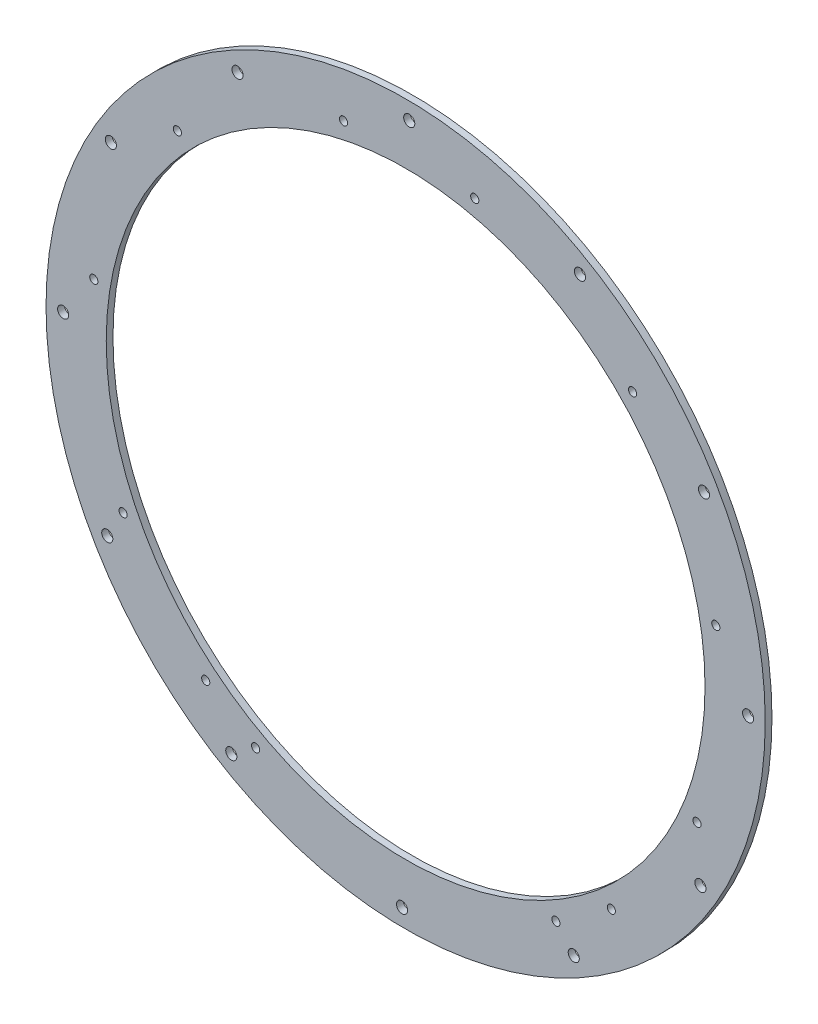
ISO-10303-21;
HEADER;
FILE_DESCRIPTION(('STEP AP214'),'2;1');
FILE_NAME('part.step','',(''),(''),'','','');
FILE_SCHEMA(('AUTOMOTIVE_DESIGN { 1 0 10303 214 1 1 1 1 }'));
ENDSEC;
DATA;
#1=APPLICATION_CONTEXT('core data for automotive mechanical design processes');
#2=APPLICATION_PROTOCOL_DEFINITION('international standard','automotive_design',2000,#1);
#3=PRODUCT_CONTEXT('',#1,'mechanical');
#4=PRODUCT('Part','Part','',(#3));
#5=PRODUCT_RELATED_PRODUCT_CATEGORY('part','',(#4));
#6=PRODUCT_DEFINITION_FORMATION('','',#4);
#7=PRODUCT_DEFINITION_CONTEXT('part definition',#1,'design');
#8=PRODUCT_DEFINITION('design','',#6,#7);
#9=PRODUCT_DEFINITION_SHAPE('','',#8);
#10=(LENGTH_UNIT() NAMED_UNIT(*) SI_UNIT(.MILLI.,.METRE.));
#11=(NAMED_UNIT(*) PLANE_ANGLE_UNIT() SI_UNIT($,.RADIAN.));
#12=(NAMED_UNIT(*) SI_UNIT($,.STERADIAN.) SOLID_ANGLE_UNIT());
#13=UNCERTAINTY_MEASURE_WITH_UNIT(LENGTH_MEASURE(1.E-05),#10,'distance_accuracy_value','');
#14=(GEOMETRIC_REPRESENTATION_CONTEXT(3) GLOBAL_UNCERTAINTY_ASSIGNED_CONTEXT((#13)) GLOBAL_UNIT_ASSIGNED_CONTEXT((#10,
#11,#12)) REPRESENTATION_CONTEXT('',''));
#15=CARTESIAN_POINT('',(0.,0.,0.));
#16=DIRECTION('',(0.,0.,1.));
#17=DIRECTION('',(1.,0.,0.));
#18=AXIS2_PLACEMENT_3D('',#15,#16,#17);
#19=CARTESIAN_POINT('',(-1.10064797023276,13.3304936701154,-148.865642093371));
#20=DIRECTION('',(0.,0.,-1.));
#21=DIRECTION('',(-1.,0.,0.));
#22=AXIS2_PLACEMENT_3D('',#19,#20,#21);
#23=CYLINDRICAL_SURFACE('',#22,91.6000000000059);
#24=CARTESIAN_POINT('',(-1.10064797023276,13.3304936701154,-148.865642093371));
#25=DIRECTION('',(0.,0.,1.));
#26=DIRECTION('',(1.,0.,0.));
#27=AXIS2_PLACEMENT_3D('',#24,#25,#26);
#28=CIRCLE('',#27,91.6000000000059);
#29=CARTESIAN_POINT('',(90.4993520297731,13.3304936701154,-148.865642093371));
#30=VERTEX_POINT('',#29);
#31=EDGE_CURVE('E22',#30,#30,#28,.T.);
#32=ORIENTED_EDGE('',*,*,#31,.T.);
#33=EDGE_LOOP('',(#32));
#34=FACE_BOUND('',#33,.T.);
#35=CARTESIAN_POINT('',(-1.10064797023276,13.3304936701154,-150.92564209337));
#36=DIRECTION('',(0.,0.,1.));
#37=DIRECTION('',(1.,0.,0.));
#38=AXIS2_PLACEMENT_3D('',#35,#36,#37);
#39=CIRCLE('',#38,91.6000000000059);
#40=CARTESIAN_POINT('',(90.4993520297731,13.3304936701154,-150.92564209337));
#41=VERTEX_POINT('',#40);
#42=EDGE_CURVE('E31',#41,#41,#39,.T.);
#43=ORIENTED_EDGE('',*,*,#42,.F.);
#44=EDGE_LOOP('',(#43));
#45=FACE_BOUND('',#44,.T.);
#46=ADVANCED_FACE('F15',(#34,#45),#23,.F.);
#47=CARTESIAN_POINT('',(-1.10064797023276,13.3304936701154,-148.865642093371));
#48=DIRECTION('',(0.,0.,-1.));
#49=DIRECTION('',(-1.,0.,0.));
#50=AXIS2_PLACEMENT_3D('',#47,#48,#49);
#51=CYLINDRICAL_SURFACE('',#50,110.0201);
#52=CARTESIAN_POINT('',(-1.10064797023276,13.3304936701154,-148.865642093371));
#53=DIRECTION('',(0.,0.,1.));
#54=DIRECTION('',(1.,0.,0.));
#55=AXIS2_PLACEMENT_3D('',#52,#53,#54);
#56=CIRCLE('',#55,110.0201);
#57=CARTESIAN_POINT('',(108.919452029767,13.3304936701154,-148.865642093371));
#58=VERTEX_POINT('',#57);
#59=EDGE_CURVE('E10',#58,#58,#56,.T.);
#60=ORIENTED_EDGE('',*,*,#59,.F.);
#61=EDGE_LOOP('',(#60));
#62=FACE_BOUND('',#61,.T.);
#63=CARTESIAN_POINT('',(-1.10064797023276,13.3304936701154,-150.92564209337));
#64=DIRECTION('',(0.,0.,1.));
#65=DIRECTION('',(1.,0.,0.));
#66=AXIS2_PLACEMENT_3D('',#63,#64,#65);
#67=CIRCLE('',#66,110.0201);
#68=CARTESIAN_POINT('',(108.919452029767,13.3304936701154,-150.92564209337));
#69=VERTEX_POINT('',#68);
#70=EDGE_CURVE('E27',#69,#69,#67,.T.);
#71=ORIENTED_EDGE('',*,*,#70,.T.);
#72=EDGE_LOOP('',(#71));
#73=FACE_BOUND('',#72,.T.);
#74=ADVANCED_FACE('F202',(#62,#73),#51,.T.);
#75=CARTESIAN_POINT('',(0.,0.,-148.865642093371));
#76=DIRECTION('',(0.,0.,1.));
#77=DIRECTION('',(1.,0.,0.));
#78=AXIS2_PLACEMENT_3D('',#75,#76,#77);
#79=PLANE('',#78);
#80=CARTESIAN_POINT('',(0.,118.105493670115,-148.865642093371));
#81=DIRECTION('',(0.,0.,1.));
#82=DIRECTION('',(1.,0.,0.));
#83=AXIS2_PLACEMENT_3D('',#80,#81,#82);
#84=CIRCLE('',#83,1.7);
#85=CARTESIAN_POINT('',(1.7,118.105493670115,-148.865642093371));
#86=VERTEX_POINT('',#85);
#87=EDGE_CURVE('E103',#86,#86,#84,.T.);
#88=ORIENTED_EDGE('',*,*,#87,.F.);
#89=EDGE_LOOP('',(#88));
#90=FACE_BOUND('',#89,.T.);
#91=CARTESIAN_POINT('',(52.2400411326118,103.517981366516,-148.865642093371));
#92=DIRECTION('',(0.,0.,1.));
#93=DIRECTION('',(1.,0.,0.));
#94=AXIS2_PLACEMENT_3D('',#91,#92,#93);
#95=CIRCLE('',#94,1.7);
#96=CARTESIAN_POINT('',(53.9400411326118,103.517981366516,-148.865642093371));
#97=VERTEX_POINT('',#96);
#98=EDGE_CURVE('E93',#97,#97,#95,.T.);
#99=ORIENTED_EDGE('',*,*,#98,.F.);
#100=EDGE_LOOP('',(#99));
#101=FACE_BOUND('',#100,.T.);
#102=CARTESIAN_POINT('',(90.1874876963991,64.7648045672736,-148.865642093371));
#103=DIRECTION('',(0.,0.,1.));
#104=DIRECTION('',(1.,0.,0.));
#105=AXIS2_PLACEMENT_3D('',#102,#103,#104);
#106=CIRCLE('',#105,1.7);
#107=CARTESIAN_POINT('',(91.8874876963991,64.7648045672736,-148.865642093371));
#108=VERTEX_POINT('',#107);
#109=EDGE_CURVE('E90',#108,#108,#106,.T.);
#110=ORIENTED_EDGE('',*,*,#109,.F.);
#111=EDGE_LOOP('',(#110));
#112=FACE_BOUND('',#111,.T.);
#113=CARTESIAN_POINT('',(103.67435202977,12.2298456998866,-148.865642093371));
#114=DIRECTION('',(0.,0.,1.));
#115=DIRECTION('',(1.,0.,0.));
#116=AXIS2_PLACEMENT_3D('',#113,#114,#115);
#117=CIRCLE('',#116,1.7);
#118=CARTESIAN_POINT('',(105.37435202977,12.2298456998866,-148.865642093371));
#119=VERTEX_POINT('',#118);
#120=EDGE_CURVE('E89',#119,#119,#117,.T.);
#121=ORIENTED_EDGE('',*,*,#120,.F.);
#122=EDGE_LOOP('',(#121));
#123=FACE_BOUND('',#122,.T.);
#124=CARTESIAN_POINT('',(89.0868397261704,-40.0101954327266,-148.865642093371));
#125=DIRECTION('',(0.,0.,1.));
#126=DIRECTION('',(1.,0.,0.));
#127=AXIS2_PLACEMENT_3D('',#124,#125,#126);
#128=CIRCLE('',#127,1.7);
#129=CARTESIAN_POINT('',(90.7868397261704,-40.0101954327266,-148.865642093371));
#130=VERTEX_POINT('',#129);
#131=EDGE_CURVE('E86',#130,#130,#128,.T.);
#132=ORIENTED_EDGE('',*,*,#131,.F.);
#133=EDGE_LOOP('',(#132));
#134=FACE_BOUND('',#133,.T.);
#135=CARTESIAN_POINT('',(50.3336629269282,-77.9576419965137,-148.865642093371));
#136=DIRECTION('',(0.,0.,1.));
#137=DIRECTION('',(1.,0.,0.));
#138=AXIS2_PLACEMENT_3D('',#135,#136,#137);
#139=CIRCLE('',#138,1.7);
#140=CARTESIAN_POINT('',(52.0336629269282,-77.9576419965137,-148.865642093371));
#141=VERTEX_POINT('',#140);
#142=EDGE_CURVE('E82',#141,#141,#139,.T.);
#143=ORIENTED_EDGE('',*,*,#142,.F.);
#144=EDGE_LOOP('',(#143));
#145=FACE_BOUND('',#144,.T.);
#146=CARTESIAN_POINT('',(-2.20129594045893,-91.4445063298847,-148.865642093371));
#147=DIRECTION('',(0.,0.,1.));
#148=DIRECTION('',(1.,0.,0.));
#149=AXIS2_PLACEMENT_3D('',#146,#147,#148);
#150=CIRCLE('',#149,1.7);
#151=CARTESIAN_POINT('',(-0.50129594045893,-91.4445063298847,-148.865642093371));
#152=VERTEX_POINT('',#151);
#153=EDGE_CURVE('E78',#152,#152,#150,.T.);
#154=ORIENTED_EDGE('',*,*,#153,.F.);
#155=EDGE_LOOP('',(#154));
#156=FACE_BOUND('',#155,.T.);
#157=CARTESIAN_POINT('',(-54.4413370730721,-76.8569940262846,-148.865642093371));
#158=DIRECTION('',(0.,0.,1.));
#159=DIRECTION('',(1.,0.,0.));
#160=AXIS2_PLACEMENT_3D('',#157,#158,#159);
#161=CIRCLE('',#160,1.7);
#162=CARTESIAN_POINT('',(-52.7413370730721,-76.8569940262846,-148.865642093371));
#163=VERTEX_POINT('',#162);
#164=EDGE_CURVE('E77',#163,#163,#161,.T.);
#165=ORIENTED_EDGE('',*,*,#164,.F.);
#166=EDGE_LOOP('',(#165));
#167=FACE_BOUND('',#166,.T.);
#168=CARTESIAN_POINT('',(-92.3887836368591,-38.1038172270423,-148.865642093371));
#169=DIRECTION('',(0.,0.,1.));
#170=DIRECTION('',(1.,0.,0.));
#171=AXIS2_PLACEMENT_3D('',#168,#169,#170);
#172=CIRCLE('',#171,1.7);
#173=CARTESIAN_POINT('',(-90.6887836368591,-38.1038172270423,-148.865642093371));
#174=VERTEX_POINT('',#173);
#175=EDGE_CURVE('E73',#174,#174,#172,.T.);
#176=ORIENTED_EDGE('',*,*,#175,.F.);
#177=EDGE_LOOP('',(#176));
#178=FACE_BOUND('',#177,.T.);
#179=CARTESIAN_POINT('',(-105.87564797023,14.4311416403448,-148.865642093371));
#180=DIRECTION('',(0.,0.,1.));
#181=DIRECTION('',(1.,0.,0.));
#182=AXIS2_PLACEMENT_3D('',#179,#180,#181);
#183=CIRCLE('',#182,1.7);
#184=CARTESIAN_POINT('',(-104.17564797023,14.4311416403448,-148.865642093371));
#185=VERTEX_POINT('',#184);
#186=EDGE_CURVE('E72',#185,#185,#183,.T.);
#187=ORIENTED_EDGE('',*,*,#186,.F.);
#188=EDGE_LOOP('',(#187));
#189=FACE_BOUND('',#188,.T.);
#190=CARTESIAN_POINT('',(-91.2881356666296,66.671182772958,-148.865642093371));
#191=DIRECTION('',(0.,0.,1.));
#192=DIRECTION('',(1.,0.,0.));
#193=AXIS2_PLACEMENT_3D('',#190,#191,#192);
#194=CIRCLE('',#193,1.7);
#195=CARTESIAN_POINT('',(-89.5881356666296,66.671182772958,-148.865642093371));
#196=VERTEX_POINT('',#195);
#197=EDGE_CURVE('E68',#196,#196,#194,.T.);
#198=ORIENTED_EDGE('',*,*,#197,.F.);
#199=EDGE_LOOP('',(#198));
#200=FACE_BOUND('',#199,.T.);
#201=CARTESIAN_POINT('',(-52.5349588673871,104.618629336745,-148.865642093371));
#202=DIRECTION('',(0.,0.,1.));
#203=DIRECTION('',(1.,0.,0.));
#204=AXIS2_PLACEMENT_3D('',#201,#202,#203);
#205=CIRCLE('',#204,1.7);
#206=CARTESIAN_POINT('',(-50.8349588673871,104.618629336745,-148.865642093371));
#207=VERTEX_POINT('',#206);
#208=EDGE_CURVE('E67',#207,#207,#205,.T.);
#209=ORIENTED_EDGE('',*,*,#208,.F.);
#210=EDGE_LOOP('',(#209));
#211=FACE_BOUND('',#210,.T.);
#212=CARTESIAN_POINT('',(44.8699907811426,-71.5845799933777,-148.865642093371));
#213=DIRECTION('',(0.,0.,1.));
#214=DIRECTION('',(1.,0.,0.));
#215=AXIS2_PLACEMENT_3D('',#212,#213,#214);
#216=CIRCLE('',#215,1.25);
#217=CARTESIAN_POINT('',(46.1199907811426,-71.5845799933777,-148.865642093371));
#218=VERTEX_POINT('',#217);
#219=EDGE_CURVE('E63',#218,#218,#216,.T.);
#220=ORIENTED_EDGE('',*,*,#219,.F.);
#221=EDGE_LOOP('',(#220));
#222=FACE_BOUND('',#221,.T.);
#223=CARTESIAN_POINT('',(61.8322588785693,-59.9118074049485,-148.865642093371));
#224=DIRECTION('',(0.,0.,1.));
#225=DIRECTION('',(1.,0.,0.));
#226=AXIS2_PLACEMENT_3D('',#223,#224,#225);
#227=CIRCLE('',#226,1.25);
#228=CARTESIAN_POINT('',(63.0822588785693,-59.9118074049485,-148.865642093371));
#229=VERTEX_POINT('',#228);
#230=EDGE_CURVE('E62',#229,#229,#227,.T.);
#231=ORIENTED_EDGE('',*,*,#230,.F.);
#232=EDGE_LOOP('',(#231));
#233=FACE_BOUND('',#232,.T.);
#234=CARTESIAN_POINT('',(88.0399097264579,-23.8227709903943,-148.865642093371));
#235=DIRECTION('',(0.,0.,1.));
#236=DIRECTION('',(1.,0.,0.));
#237=AXIS2_PLACEMENT_3D('',#234,#235,#236);
#238=CIRCLE('',#237,1.25);
#239=CARTESIAN_POINT('',(89.2899097264579,-23.8227709903943,-148.865642093371));
#240=VERTEX_POINT('',#239);
#241=EDGE_CURVE('E58',#240,#240,#238,.T.);
#242=ORIENTED_EDGE('',*,*,#241,.F.);
#243=EDGE_LOOP('',(#242));
#244=FACE_BOUND('',#243,.T.);
#245=CARTESIAN_POINT('',(93.7929721520401,31.2502579809717,-148.865642093371));
#246=DIRECTION('',(0.,0.,1.));
#247=DIRECTION('',(1.,0.,0.));
#248=AXIS2_PLACEMENT_3D('',#245,#246,#247);
#249=CIRCLE('',#248,1.25);
#250=CARTESIAN_POINT('',(95.0429721520401,31.2502579809717,-148.865642093371));
#251=VERTEX_POINT('',#250);
#252=EDGE_CURVE('E54',#251,#251,#249,.T.);
#253=ORIENTED_EDGE('',*,*,#252,.F.);
#254=EDGE_LOOP('',(#253));
#255=FACE_BOUND('',#254,.T.);
#256=CARTESIAN_POINT('',(68.3364618175925,80.4244618783986,-148.865642093371));
#257=DIRECTION('',(0.,0.,1.));
#258=DIRECTION('',(1.,0.,0.));
#259=AXIS2_PLACEMENT_3D('',#256,#257,#258);
#260=CIRCLE('',#259,1.25);
#261=CARTESIAN_POINT('',(69.5864618175925,80.4244618783986,-148.865642093371));
#262=VERTEX_POINT('',#261);
#263=EDGE_CURVE('E50',#262,#262,#260,.T.);
#264=ORIENTED_EDGE('',*,*,#263,.F.);
#265=EDGE_LOOP('',(#264));
#266=FACE_BOUND('',#265,.T.);
#267=CARTESIAN_POINT('',(20.0461911809335,107.520328891502,-148.865642093371));
#268=DIRECTION('',(0.,0.,1.));
#269=DIRECTION('',(1.,0.,0.));
#270=AXIS2_PLACEMENT_3D('',#267,#268,#269);
#271=CIRCLE('',#270,1.25);
#272=CARTESIAN_POINT('',(21.2961911809335,107.520328891502,-148.865642093371));
#273=VERTEX_POINT('',#272);
#274=EDGE_CURVE('E46',#273,#273,#271,.T.);
#275=ORIENTED_EDGE('',*,*,#274,.F.);
#276=EDGE_LOOP('',(#275));
#277=FACE_BOUND('',#276,.T.);
#278=CARTESIAN_POINT('',(-20.0926023064868,107.961901254747,-148.865642093371));
#279=DIRECTION('',(0.,0.,1.));
#280=DIRECTION('',(1.,0.,0.));
#281=AXIS2_PLACEMENT_3D('',#278,#279,#280);
#282=CIRCLE('',#281,1.25);
#283=CARTESIAN_POINT('',(-18.8426023064868,107.961901254747,-148.865642093371));
#284=VERTEX_POINT('',#283);
#285=EDGE_CURVE('E45',#284,#284,#282,.T.);
#286=ORIENTED_EDGE('',*,*,#285,.F.);
#287=EDGE_LOOP('',(#286));
#288=FACE_BOUND('',#287,.T.);
#289=CARTESIAN_POINT('',(-70.9341447207753,79.9309241577256,-148.865642093371));
#290=DIRECTION('',(0.,0.,1.));
#291=DIRECTION('',(1.,0.,0.));
#292=AXIS2_PLACEMENT_3D('',#289,#290,#291);
#293=CIRCLE('',#292,1.25);
#294=CARTESIAN_POINT('',(-69.6841447207753,79.9309241577256,-148.865642093371));
#295=VERTEX_POINT('',#294);
#296=EDGE_CURVE('E156',#295,#295,#293,.T.);
#297=ORIENTED_EDGE('',*,*,#296,.F.);
#298=EDGE_LOOP('',(#297));
#299=FACE_BOUND('',#298,.T.);
#300=CARTESIAN_POINT('',(-96.5031901734979,27.8077812487047,-148.865642093371));
#301=DIRECTION('',(0.,0.,1.));
#302=DIRECTION('',(1.,0.,0.));
#303=AXIS2_PLACEMENT_3D('',#300,#301,#302);
#304=CIRCLE('',#303,1.25);
#305=CARTESIAN_POINT('',(-95.2531901734979,27.8077812487047,-148.865642093371));
#306=VERTEX_POINT('',#305);
#307=EDGE_CURVE('E162',#306,#306,#304,.T.);
#308=ORIENTED_EDGE('',*,*,#307,.F.);
#309=EDGE_LOOP('',(#308));
#310=FACE_BOUND('',#309,.T.);
#311=CARTESIAN_POINT('',(-87.5515194654412,-29.5547997916575,-148.865642093371));
#312=DIRECTION('',(0.,0.,1.));
#313=DIRECTION('',(1.,0.,0.));
#314=AXIS2_PLACEMENT_3D('',#311,#312,#313);
#315=CIRCLE('',#314,1.25);
#316=CARTESIAN_POINT('',(-86.3015194654412,-29.5547997916575,-148.865642093371));
#317=VERTEX_POINT('',#316);
#318=EDGE_CURVE('E41',#317,#317,#315,.T.);
#319=ORIENTED_EDGE('',*,*,#318,.F.);
#320=EDGE_LOOP('',(#319));
#321=FACE_BOUND('',#320,.T.);
#322=CARTESIAN_POINT('',(-46.9938365423305,-71.5845799933777,-148.865642093371));
#323=DIRECTION('',(0.,0.,1.));
#324=DIRECTION('',(1.,0.,0.));
#325=AXIS2_PLACEMENT_3D('',#322,#323,#324);
#326=CIRCLE('',#325,1.25);
#327=CARTESIAN_POINT('',(-45.7438365423305,-71.5845799933777,-148.865642093371));
#328=VERTEX_POINT('',#327);
#329=EDGE_CURVE('E40',#328,#328,#326,.T.);
#330=ORIENTED_EDGE('',*,*,#329,.F.);
#331=EDGE_LOOP('',(#330));
#332=FACE_BOUND('',#331,.T.);
#333=CARTESIAN_POINT('',(-62.261710612582,-61.3335728082202,-148.865642093371));
#334=DIRECTION('',(0.,0.,1.));
#335=DIRECTION('',(1.,0.,0.));
#336=AXIS2_PLACEMENT_3D('',#333,#334,#335);
#337=CIRCLE('',#336,1.25);
#338=CARTESIAN_POINT('',(-61.011710612582,-61.3335728082202,-148.865642093371));
#339=VERTEX_POINT('',#338);
#340=EDGE_CURVE('E175',#339,#339,#337,.T.);
#341=ORIENTED_EDGE('',*,*,#340,.F.);
#342=EDGE_LOOP('',(#341));
#343=FACE_BOUND('',#342,.T.);
#344=ORIENTED_EDGE('',*,*,#31,.F.);
#345=EDGE_LOOP('',(#344));
#346=FACE_BOUND('',#345,.T.);
#347=ORIENTED_EDGE('',*,*,#59,.T.);
#348=EDGE_LOOP('',(#347));
#349=FACE_BOUND('',#348,.T.);
#350=ADVANCED_FACE('F197',(#90,#101,#112,#123,#134,#145,#156,#167,#178,#189,#200,#211,#222,#233,
#244,#255,#266,#277,#288,#299,#310,#321,#332,#343,#346,#349),#79,.T.);
#351=CARTESIAN_POINT('',(0.,0.,-150.92564209337));
#352=DIRECTION('',(0.,0.,1.));
#353=DIRECTION('',(1.,0.,0.));
#354=AXIS2_PLACEMENT_3D('',#351,#352,#353);
#355=PLANE('',#354);
#356=CARTESIAN_POINT('',(0.,118.105493670115,-150.92564209337));
#357=DIRECTION('',(0.,0.,1.));
#358=DIRECTION('',(1.,0.,0.));
#359=AXIS2_PLACEMENT_3D('',#356,#357,#358);
#360=CIRCLE('',#359,1.7);
#361=CARTESIAN_POINT('',(1.7,118.105493670115,-150.92564209337));
#362=VERTEX_POINT('',#361);
#363=EDGE_CURVE('E18',#362,#362,#360,.T.);
#364=ORIENTED_EDGE('',*,*,#363,.T.);
#365=EDGE_LOOP('',(#364));
#366=FACE_BOUND('',#365,.T.);
#367=CARTESIAN_POINT('',(52.2400411326118,103.517981366516,-150.92564209337));
#368=DIRECTION('',(0.,0.,1.));
#369=DIRECTION('',(1.,0.,0.));
#370=AXIS2_PLACEMENT_3D('',#367,#368,#369);
#371=CIRCLE('',#370,1.7);
#372=CARTESIAN_POINT('',(53.9400411326118,103.517981366516,-150.92564209337));
#373=VERTEX_POINT('',#372);
#374=EDGE_CURVE('E91',#373,#373,#371,.T.);
#375=ORIENTED_EDGE('',*,*,#374,.T.);
#376=EDGE_LOOP('',(#375));
#377=FACE_BOUND('',#376,.T.);
#378=CARTESIAN_POINT('',(90.1874876963991,64.7648045672736,-150.92564209337));
#379=DIRECTION('',(0.,0.,1.));
#380=DIRECTION('',(1.,0.,0.));
#381=AXIS2_PLACEMENT_3D('',#378,#379,#380);
#382=CIRCLE('',#381,1.7);
#383=CARTESIAN_POINT('',(91.8874876963991,64.7648045672736,-150.92564209337));
#384=VERTEX_POINT('',#383);
#385=EDGE_CURVE('E87',#384,#384,#382,.T.);
#386=ORIENTED_EDGE('',*,*,#385,.T.);
#387=EDGE_LOOP('',(#386));
#388=FACE_BOUND('',#387,.T.);
#389=CARTESIAN_POINT('',(103.67435202977,12.2298456998866,-150.92564209337));
#390=DIRECTION('',(0.,0.,1.));
#391=DIRECTION('',(1.,0.,0.));
#392=AXIS2_PLACEMENT_3D('',#389,#390,#391);
#393=CIRCLE('',#392,1.7);
#394=CARTESIAN_POINT('',(105.37435202977,12.2298456998866,-150.92564209337));
#395=VERTEX_POINT('',#394);
#396=EDGE_CURVE('E108',#395,#395,#393,.T.);
#397=ORIENTED_EDGE('',*,*,#396,.T.);
#398=EDGE_LOOP('',(#397));
#399=FACE_BOUND('',#398,.T.);
#400=CARTESIAN_POINT('',(89.0868397261704,-40.0101954327266,-150.92564209337));
#401=DIRECTION('',(0.,0.,1.));
#402=DIRECTION('',(1.,0.,0.));
#403=AXIS2_PLACEMENT_3D('',#400,#401,#402);
#404=CIRCLE('',#403,1.7);
#405=CARTESIAN_POINT('',(90.7868397261704,-40.0101954327266,-150.92564209337));
#406=VERTEX_POINT('',#405);
#407=EDGE_CURVE('E83',#406,#406,#404,.T.);
#408=ORIENTED_EDGE('',*,*,#407,.T.);
#409=EDGE_LOOP('',(#408));
#410=FACE_BOUND('',#409,.T.);
#411=CARTESIAN_POINT('',(50.3336629269282,-77.9576419965137,-150.92564209337));
#412=DIRECTION('',(0.,0.,1.));
#413=DIRECTION('',(1.,0.,0.));
#414=AXIS2_PLACEMENT_3D('',#411,#412,#413);
#415=CIRCLE('',#414,1.7);
#416=CARTESIAN_POINT('',(52.0336629269282,-77.9576419965137,-150.92564209337));
#417=VERTEX_POINT('',#416);
#418=EDGE_CURVE('E79',#417,#417,#415,.T.);
#419=ORIENTED_EDGE('',*,*,#418,.T.);
#420=EDGE_LOOP('',(#419));
#421=FACE_BOUND('',#420,.T.);
#422=CARTESIAN_POINT('',(-2.20129594045893,-91.4445063298847,-150.92564209337));
#423=DIRECTION('',(0.,0.,1.));
#424=DIRECTION('',(1.,0.,0.));
#425=AXIS2_PLACEMENT_3D('',#422,#423,#424);
#426=CIRCLE('',#425,1.7);
#427=CARTESIAN_POINT('',(-0.50129594045893,-91.4445063298847,-150.92564209337));
#428=VERTEX_POINT('',#427);
#429=EDGE_CURVE('E74',#428,#428,#426,.T.);
#430=ORIENTED_EDGE('',*,*,#429,.T.);
#431=EDGE_LOOP('',(#430));
#432=FACE_BOUND('',#431,.T.);
#433=CARTESIAN_POINT('',(-54.4413370730721,-76.8569940262846,-150.92564209337));
#434=DIRECTION('',(0.,0.,1.));
#435=DIRECTION('',(1.,0.,0.));
#436=AXIS2_PLACEMENT_3D('',#433,#434,#435);
#437=CIRCLE('',#436,1.7);
#438=CARTESIAN_POINT('',(-52.7413370730721,-76.8569940262846,-150.92564209337));
#439=VERTEX_POINT('',#438);
#440=EDGE_CURVE('E119',#439,#439,#437,.T.);
#441=ORIENTED_EDGE('',*,*,#440,.T.);
#442=EDGE_LOOP('',(#441));
#443=FACE_BOUND('',#442,.T.);
#444=CARTESIAN_POINT('',(-92.3887836368591,-38.1038172270423,-150.92564209337));
#445=DIRECTION('',(0.,0.,1.));
#446=DIRECTION('',(1.,0.,0.));
#447=AXIS2_PLACEMENT_3D('',#444,#445,#446);
#448=CIRCLE('',#447,1.7);
#449=CARTESIAN_POINT('',(-90.6887836368591,-38.1038172270423,-150.92564209337));
#450=VERTEX_POINT('',#449);
#451=EDGE_CURVE('E69',#450,#450,#448,.T.);
#452=ORIENTED_EDGE('',*,*,#451,.T.);
#453=EDGE_LOOP('',(#452));
#454=FACE_BOUND('',#453,.T.);
#455=CARTESIAN_POINT('',(-105.87564797023,14.4311416403448,-150.92564209337));
#456=DIRECTION('',(0.,0.,1.));
#457=DIRECTION('',(1.,0.,0.));
#458=AXIS2_PLACEMENT_3D('',#455,#456,#457);
#459=CIRCLE('',#458,1.7);
#460=CARTESIAN_POINT('',(-104.17564797023,14.4311416403448,-150.92564209337));
#461=VERTEX_POINT('',#460);
#462=EDGE_CURVE('E126',#461,#461,#459,.T.);
#463=ORIENTED_EDGE('',*,*,#462,.T.);
#464=EDGE_LOOP('',(#463));
#465=FACE_BOUND('',#464,.T.);
#466=CARTESIAN_POINT('',(-91.2881356666296,66.671182772958,-150.92564209337));
#467=DIRECTION('',(0.,0.,1.));
#468=DIRECTION('',(1.,0.,0.));
#469=AXIS2_PLACEMENT_3D('',#466,#467,#468);
#470=CIRCLE('',#469,1.7);
#471=CARTESIAN_POINT('',(-89.5881356666296,66.671182772958,-150.92564209337));
#472=VERTEX_POINT('',#471);
#473=EDGE_CURVE('E64',#472,#472,#470,.T.);
#474=ORIENTED_EDGE('',*,*,#473,.T.);
#475=EDGE_LOOP('',(#474));
#476=FACE_BOUND('',#475,.T.);
#477=CARTESIAN_POINT('',(-52.5349588673871,104.618629336745,-150.92564209337));
#478=DIRECTION('',(0.,0.,1.));
#479=DIRECTION('',(1.,0.,0.));
#480=AXIS2_PLACEMENT_3D('',#477,#478,#479);
#481=CIRCLE('',#480,1.7);
#482=CARTESIAN_POINT('',(-50.8349588673871,104.618629336745,-150.92564209337));
#483=VERTEX_POINT('',#482);
#484=EDGE_CURVE('E133',#483,#483,#481,.T.);
#485=ORIENTED_EDGE('',*,*,#484,.T.);
#486=EDGE_LOOP('',(#485));
#487=FACE_BOUND('',#486,.T.);
#488=CARTESIAN_POINT('',(44.8699907811426,-71.5845799933777,-150.92564209337));
#489=DIRECTION('',(0.,0.,1.));
#490=DIRECTION('',(1.,0.,0.));
#491=AXIS2_PLACEMENT_3D('',#488,#489,#490);
#492=CIRCLE('',#491,1.25);
#493=CARTESIAN_POINT('',(46.1199907811426,-71.5845799933777,-150.92564209337));
#494=VERTEX_POINT('',#493);
#495=EDGE_CURVE('E59',#494,#494,#492,.T.);
#496=ORIENTED_EDGE('',*,*,#495,.T.);
#497=EDGE_LOOP('',(#496));
#498=FACE_BOUND('',#497,.T.);
#499=CARTESIAN_POINT('',(61.8322588785693,-59.9118074049485,-150.92564209337));
#500=DIRECTION('',(0.,0.,1.));
#501=DIRECTION('',(1.,0.,0.));
#502=AXIS2_PLACEMENT_3D('',#499,#500,#501);
#503=CIRCLE('',#502,1.25);
#504=CARTESIAN_POINT('',(63.0822588785693,-59.9118074049485,-150.92564209337));
#505=VERTEX_POINT('',#504);
#506=EDGE_CURVE('E140',#505,#505,#503,.T.);
#507=ORIENTED_EDGE('',*,*,#506,.T.);
#508=EDGE_LOOP('',(#507));
#509=FACE_BOUND('',#508,.T.);
#510=CARTESIAN_POINT('',(88.0399097264579,-23.8227709903943,-150.92564209337));
#511=DIRECTION('',(0.,0.,1.));
#512=DIRECTION('',(1.,0.,0.));
#513=AXIS2_PLACEMENT_3D('',#510,#511,#512);
#514=CIRCLE('',#513,1.25);
#515=CARTESIAN_POINT('',(89.2899097264579,-23.8227709903943,-150.92564209337));
#516=VERTEX_POINT('',#515);
#517=EDGE_CURVE('E55',#516,#516,#514,.T.);
#518=ORIENTED_EDGE('',*,*,#517,.T.);
#519=EDGE_LOOP('',(#518));
#520=FACE_BOUND('',#519,.T.);
#521=CARTESIAN_POINT('',(93.7929721520401,31.2502579809717,-150.92564209337));
#522=DIRECTION('',(0.,0.,1.));
#523=DIRECTION('',(1.,0.,0.));
#524=AXIS2_PLACEMENT_3D('',#521,#522,#523);
#525=CIRCLE('',#524,1.25);
#526=CARTESIAN_POINT('',(95.0429721520401,31.2502579809717,-150.92564209337));
#527=VERTEX_POINT('',#526);
#528=EDGE_CURVE('E51',#527,#527,#525,.T.);
#529=ORIENTED_EDGE('',*,*,#528,.T.);
#530=EDGE_LOOP('',(#529));
#531=FACE_BOUND('',#530,.T.);
#532=CARTESIAN_POINT('',(68.3364618175925,80.4244618783986,-150.92564209337));
#533=DIRECTION('',(0.,0.,1.));
#534=DIRECTION('',(1.,0.,0.));
#535=AXIS2_PLACEMENT_3D('',#532,#533,#534);
#536=CIRCLE('',#535,1.25);
#537=CARTESIAN_POINT('',(69.5864618175925,80.4244618783986,-150.92564209337));
#538=VERTEX_POINT('',#537);
#539=EDGE_CURVE('E47',#538,#538,#536,.T.);
#540=ORIENTED_EDGE('',*,*,#539,.T.);
#541=EDGE_LOOP('',(#540));
#542=FACE_BOUND('',#541,.T.);
#543=CARTESIAN_POINT('',(20.0461911809335,107.520328891502,-150.92564209337));
#544=DIRECTION('',(0.,0.,1.));
#545=DIRECTION('',(1.,0.,0.));
#546=AXIS2_PLACEMENT_3D('',#543,#544,#545);
#547=CIRCLE('',#546,1.25);
#548=CARTESIAN_POINT('',(21.2961911809335,107.520328891502,-150.92564209337));
#549=VERTEX_POINT('',#548);
#550=EDGE_CURVE('E42',#549,#549,#547,.T.);
#551=ORIENTED_EDGE('',*,*,#550,.T.);
#552=EDGE_LOOP('',(#551));
#553=FACE_BOUND('',#552,.T.);
#554=CARTESIAN_POINT('',(-20.0926023064868,107.961901254747,-150.92564209337));
#555=DIRECTION('',(0.,0.,1.));
#556=DIRECTION('',(1.,0.,0.));
#557=AXIS2_PLACEMENT_3D('',#554,#555,#556);
#558=CIRCLE('',#557,1.25);
#559=CARTESIAN_POINT('',(-18.8426023064868,107.961901254747,-150.92564209337));
#560=VERTEX_POINT('',#559);
#561=EDGE_CURVE('E153',#560,#560,#558,.T.);
#562=ORIENTED_EDGE('',*,*,#561,.T.);
#563=EDGE_LOOP('',(#562));
#564=FACE_BOUND('',#563,.T.);
#565=CARTESIAN_POINT('',(-70.9341447207753,79.9309241577256,-150.92564209337));
#566=DIRECTION('',(0.,0.,1.));
#567=DIRECTION('',(1.,0.,0.));
#568=AXIS2_PLACEMENT_3D('',#565,#566,#567);
#569=CIRCLE('',#568,1.25);
#570=CARTESIAN_POINT('',(-69.6841447207753,79.9309241577256,-150.92564209337));
#571=VERTEX_POINT('',#570);
#572=EDGE_CURVE('E159',#571,#571,#569,.T.);
#573=ORIENTED_EDGE('',*,*,#572,.T.);
#574=EDGE_LOOP('',(#573));
#575=FACE_BOUND('',#574,.T.);
#576=CARTESIAN_POINT('',(-96.5031901734979,27.8077812487047,-150.92564209337));
#577=DIRECTION('',(0.,0.,1.));
#578=DIRECTION('',(1.,0.,0.));
#579=AXIS2_PLACEMENT_3D('',#576,#577,#578);
#580=CIRCLE('',#579,1.25);
#581=CARTESIAN_POINT('',(-95.2531901734979,27.8077812487047,-150.92564209337));
#582=VERTEX_POINT('',#581);
#583=EDGE_CURVE('E165',#582,#582,#580,.T.);
#584=ORIENTED_EDGE('',*,*,#583,.T.);
#585=EDGE_LOOP('',(#584));
#586=FACE_BOUND('',#585,.T.);
#587=CARTESIAN_POINT('',(-87.5515194654412,-29.5547997916575,-150.92564209337));
#588=DIRECTION('',(0.,0.,1.));
#589=DIRECTION('',(1.,0.,0.));
#590=AXIS2_PLACEMENT_3D('',#587,#588,#589);
#591=CIRCLE('',#590,1.25);
#592=CARTESIAN_POINT('',(-86.3015194654412,-29.5547997916575,-150.92564209337));
#593=VERTEX_POINT('',#592);
#594=EDGE_CURVE('E37',#593,#593,#591,.T.);
#595=ORIENTED_EDGE('',*,*,#594,.T.);
#596=EDGE_LOOP('',(#595));
#597=FACE_BOUND('',#596,.T.);
#598=CARTESIAN_POINT('',(-46.9938365423305,-71.5845799933777,-150.92564209337));
#599=DIRECTION('',(0.,0.,1.));
#600=DIRECTION('',(1.,0.,0.));
#601=AXIS2_PLACEMENT_3D('',#598,#599,#600);
#602=CIRCLE('',#601,1.25);
#603=CARTESIAN_POINT('',(-45.7438365423305,-71.5845799933777,-150.92564209337));
#604=VERTEX_POINT('',#603);
#605=EDGE_CURVE('E172',#604,#604,#602,.T.);
#606=ORIENTED_EDGE('',*,*,#605,.T.);
#607=EDGE_LOOP('',(#606));
#608=FACE_BOUND('',#607,.T.);
#609=CARTESIAN_POINT('',(-62.261710612582,-61.3335728082202,-150.92564209337));
#610=DIRECTION('',(0.,0.,1.));
#611=DIRECTION('',(1.,0.,0.));
#612=AXIS2_PLACEMENT_3D('',#609,#610,#611);
#613=CIRCLE('',#612,1.25);
#614=CARTESIAN_POINT('',(-61.011710612582,-61.3335728082202,-150.92564209337));
#615=VERTEX_POINT('',#614);
#616=EDGE_CURVE('E34',#615,#615,#613,.T.);
#617=ORIENTED_EDGE('',*,*,#616,.T.);
#618=EDGE_LOOP('',(#617));
#619=FACE_BOUND('',#618,.T.);
#620=ORIENTED_EDGE('',*,*,#42,.T.);
#621=EDGE_LOOP('',(#620));
#622=FACE_BOUND('',#621,.T.);
#623=ORIENTED_EDGE('',*,*,#70,.F.);
#624=EDGE_LOOP('',(#623));
#625=FACE_BOUND('',#624,.T.);
#626=ADVANCED_FACE('F180',(#366,#377,#388,#399,#410,#421,#432,#443,#454,#465,#476,#487,#498,
#509,#520,#531,#542,#553,#564,#575,#586,#597,#608,#619,#622,#625),#355,.F.);
#627=CARTESIAN_POINT('',(-62.261710612582,-61.3335728082202,-148.865642093371));
#628=DIRECTION('',(0.,0.,1.));
#629=DIRECTION('',(1.,0.,0.));
#630=AXIS2_PLACEMENT_3D('',#627,#628,#629);
#631=CYLINDRICAL_SURFACE('',#630,1.25);
#632=ORIENTED_EDGE('',*,*,#340,.T.);
#633=EDGE_LOOP('',(#632));
#634=FACE_BOUND('',#633,.T.);
#635=ORIENTED_EDGE('',*,*,#616,.F.);
#636=EDGE_LOOP('',(#635));
#637=FACE_BOUND('',#636,.T.);
#638=ADVANCED_FACE('F183',(#634,#637),#631,.F.);
#639=CARTESIAN_POINT('',(-46.9938365423305,-71.5845799933777,-148.865642093371));
#640=DIRECTION('',(0.,0.,1.));
#641=DIRECTION('',(1.,0.,0.));
#642=AXIS2_PLACEMENT_3D('',#639,#640,#641);
#643=CYLINDRICAL_SURFACE('',#642,1.25);
#644=ORIENTED_EDGE('',*,*,#329,.T.);
#645=EDGE_LOOP('',(#644));
#646=FACE_BOUND('',#645,.T.);
#647=ORIENTED_EDGE('',*,*,#605,.F.);
#648=EDGE_LOOP('',(#647));
#649=FACE_BOUND('',#648,.T.);
#650=ADVANCED_FACE('F185',(#646,#649),#643,.F.);
#651=CARTESIAN_POINT('',(-87.5515194654412,-29.5547997916575,-148.865642093371));
#652=DIRECTION('',(0.,0.,1.));
#653=DIRECTION('',(1.,0.,0.));
#654=AXIS2_PLACEMENT_3D('',#651,#652,#653);
#655=CYLINDRICAL_SURFACE('',#654,1.25);
#656=ORIENTED_EDGE('',*,*,#318,.T.);
#657=EDGE_LOOP('',(#656));
#658=FACE_BOUND('',#657,.T.);
#659=ORIENTED_EDGE('',*,*,#594,.F.);
#660=EDGE_LOOP('',(#659));
#661=FACE_BOUND('',#660,.T.);
#662=ADVANCED_FACE('F194',(#658,#661),#655,.F.);
#663=CARTESIAN_POINT('',(-96.5031901734979,27.8077812487047,-148.865642093371));
#664=DIRECTION('',(0.,0.,1.));
#665=DIRECTION('',(1.,0.,0.));
#666=AXIS2_PLACEMENT_3D('',#663,#664,#665);
#667=CYLINDRICAL_SURFACE('',#666,1.25);
#668=ORIENTED_EDGE('',*,*,#307,.T.);
#669=EDGE_LOOP('',(#668));
#670=FACE_BOUND('',#669,.T.);
#671=ORIENTED_EDGE('',*,*,#583,.F.);
#672=EDGE_LOOP('',(#671));
#673=FACE_BOUND('',#672,.T.);
#674=ADVANCED_FACE('F274',(#670,#673),#667,.F.);
#675=CARTESIAN_POINT('',(-70.9341447207753,79.9309241577256,-148.865642093371));
#676=DIRECTION('',(0.,0.,1.));
#677=DIRECTION('',(1.,0.,0.));
#678=AXIS2_PLACEMENT_3D('',#675,#676,#677);
#679=CYLINDRICAL_SURFACE('',#678,1.25);
#680=ORIENTED_EDGE('',*,*,#296,.T.);
#681=EDGE_LOOP('',(#680));
#682=FACE_BOUND('',#681,.T.);
#683=ORIENTED_EDGE('',*,*,#572,.F.);
#684=EDGE_LOOP('',(#683));
#685=FACE_BOUND('',#684,.T.);
#686=ADVANCED_FACE('F282',(#682,#685),#679,.F.);
#687=CARTESIAN_POINT('',(-20.0926023064868,107.961901254747,-148.865642093371));
#688=DIRECTION('',(0.,0.,1.));
#689=DIRECTION('',(1.,0.,0.));
#690=AXIS2_PLACEMENT_3D('',#687,#688,#689);
#691=CYLINDRICAL_SURFACE('',#690,1.25);
#692=ORIENTED_EDGE('',*,*,#285,.T.);
#693=EDGE_LOOP('',(#692));
#694=FACE_BOUND('',#693,.T.);
#695=ORIENTED_EDGE('',*,*,#561,.F.);
#696=EDGE_LOOP('',(#695));
#697=FACE_BOUND('',#696,.T.);
#698=ADVANCED_FACE('F288',(#694,#697),#691,.F.);
#699=CARTESIAN_POINT('',(20.0461911809335,107.520328891502,-148.865642093371));
#700=DIRECTION('',(0.,0.,1.));
#701=DIRECTION('',(1.,0.,0.));
#702=AXIS2_PLACEMENT_3D('',#699,#700,#701);
#703=CYLINDRICAL_SURFACE('',#702,1.25);
#704=ORIENTED_EDGE('',*,*,#274,.T.);
#705=EDGE_LOOP('',(#704));
#706=FACE_BOUND('',#705,.T.);
#707=ORIENTED_EDGE('',*,*,#550,.F.);
#708=EDGE_LOOP('',(#707));
#709=FACE_BOUND('',#708,.T.);
#710=ADVANCED_FACE('F292',(#706,#709),#703,.F.);
#711=CARTESIAN_POINT('',(68.3364618175925,80.4244618783986,-148.865642093371));
#712=DIRECTION('',(0.,0.,1.));
#713=DIRECTION('',(1.,0.,0.));
#714=AXIS2_PLACEMENT_3D('',#711,#712,#713);
#715=CYLINDRICAL_SURFACE('',#714,1.25);
#716=ORIENTED_EDGE('',*,*,#263,.T.);
#717=EDGE_LOOP('',(#716));
#718=FACE_BOUND('',#717,.T.);
#719=ORIENTED_EDGE('',*,*,#539,.F.);
#720=EDGE_LOOP('',(#719));
#721=FACE_BOUND('',#720,.T.);
#722=ADVANCED_FACE('F296',(#718,#721),#715,.F.);
#723=CARTESIAN_POINT('',(93.7929721520401,31.2502579809717,-148.865642093371));
#724=DIRECTION('',(0.,0.,1.));
#725=DIRECTION('',(1.,0.,0.));
#726=AXIS2_PLACEMENT_3D('',#723,#724,#725);
#727=CYLINDRICAL_SURFACE('',#726,1.25);
#728=ORIENTED_EDGE('',*,*,#252,.T.);
#729=EDGE_LOOP('',(#728));
#730=FACE_BOUND('',#729,.T.);
#731=ORIENTED_EDGE('',*,*,#528,.F.);
#732=EDGE_LOOP('',(#731));
#733=FACE_BOUND('',#732,.T.);
#734=ADVANCED_FACE('F300',(#730,#733),#727,.F.);
#735=CARTESIAN_POINT('',(88.0399097264579,-23.8227709903943,-148.865642093371));
#736=DIRECTION('',(0.,0.,1.));
#737=DIRECTION('',(1.,0.,0.));
#738=AXIS2_PLACEMENT_3D('',#735,#736,#737);
#739=CYLINDRICAL_SURFACE('',#738,1.25);
#740=ORIENTED_EDGE('',*,*,#241,.T.);
#741=EDGE_LOOP('',(#740));
#742=FACE_BOUND('',#741,.T.);
#743=ORIENTED_EDGE('',*,*,#517,.F.);
#744=EDGE_LOOP('',(#743));
#745=FACE_BOUND('',#744,.T.);
#746=ADVANCED_FACE('F304',(#742,#745),#739,.F.);
#747=CARTESIAN_POINT('',(61.8322588785693,-59.9118074049485,-148.865642093371));
#748=DIRECTION('',(0.,0.,1.));
#749=DIRECTION('',(1.,0.,0.));
#750=AXIS2_PLACEMENT_3D('',#747,#748,#749);
#751=CYLINDRICAL_SURFACE('',#750,1.25);
#752=ORIENTED_EDGE('',*,*,#230,.T.);
#753=EDGE_LOOP('',(#752));
#754=FACE_BOUND('',#753,.T.);
#755=ORIENTED_EDGE('',*,*,#506,.F.);
#756=EDGE_LOOP('',(#755));
#757=FACE_BOUND('',#756,.T.);
#758=ADVANCED_FACE('F308',(#754,#757),#751,.F.);
#759=CARTESIAN_POINT('',(44.8699907811426,-71.5845799933777,-148.865642093371));
#760=DIRECTION('',(0.,0.,1.));
#761=DIRECTION('',(1.,0.,0.));
#762=AXIS2_PLACEMENT_3D('',#759,#760,#761);
#763=CYLINDRICAL_SURFACE('',#762,1.25);
#764=ORIENTED_EDGE('',*,*,#219,.T.);
#765=EDGE_LOOP('',(#764));
#766=FACE_BOUND('',#765,.T.);
#767=ORIENTED_EDGE('',*,*,#495,.F.);
#768=EDGE_LOOP('',(#767));
#769=FACE_BOUND('',#768,.T.);
#770=ADVANCED_FACE('F312',(#766,#769),#763,.F.);
#771=CARTESIAN_POINT('',(-52.5349588673871,104.618629336745,-148.865642093371));
#772=DIRECTION('',(0.,0.,1.));
#773=DIRECTION('',(1.,0.,0.));
#774=AXIS2_PLACEMENT_3D('',#771,#772,#773);
#775=CYLINDRICAL_SURFACE('',#774,1.7);
#776=ORIENTED_EDGE('',*,*,#208,.T.);
#777=EDGE_LOOP('',(#776));
#778=FACE_BOUND('',#777,.T.);
#779=ORIENTED_EDGE('',*,*,#484,.F.);
#780=EDGE_LOOP('',(#779));
#781=FACE_BOUND('',#780,.T.);
#782=ADVANCED_FACE('F316',(#778,#781),#775,.F.);
#783=CARTESIAN_POINT('',(-91.2881356666296,66.671182772958,-148.865642093371));
#784=DIRECTION('',(0.,0.,1.));
#785=DIRECTION('',(1.,0.,0.));
#786=AXIS2_PLACEMENT_3D('',#783,#784,#785);
#787=CYLINDRICAL_SURFACE('',#786,1.7);
#788=ORIENTED_EDGE('',*,*,#197,.T.);
#789=EDGE_LOOP('',(#788));
#790=FACE_BOUND('',#789,.T.);
#791=ORIENTED_EDGE('',*,*,#473,.F.);
#792=EDGE_LOOP('',(#791));
#793=FACE_BOUND('',#792,.T.);
#794=ADVANCED_FACE('F320',(#790,#793),#787,.F.);
#795=CARTESIAN_POINT('',(-105.87564797023,14.4311416403448,-148.865642093371));
#796=DIRECTION('',(0.,0.,1.));
#797=DIRECTION('',(1.,0.,0.));
#798=AXIS2_PLACEMENT_3D('',#795,#796,#797);
#799=CYLINDRICAL_SURFACE('',#798,1.7);
#800=ORIENTED_EDGE('',*,*,#186,.T.);
#801=EDGE_LOOP('',(#800));
#802=FACE_BOUND('',#801,.T.);
#803=ORIENTED_EDGE('',*,*,#462,.F.);
#804=EDGE_LOOP('',(#803));
#805=FACE_BOUND('',#804,.T.);
#806=ADVANCED_FACE('F324',(#802,#805),#799,.F.);
#807=CARTESIAN_POINT('',(-92.3887836368591,-38.1038172270423,-148.865642093371));
#808=DIRECTION('',(0.,0.,1.));
#809=DIRECTION('',(1.,0.,0.));
#810=AXIS2_PLACEMENT_3D('',#807,#808,#809);
#811=CYLINDRICAL_SURFACE('',#810,1.7);
#812=ORIENTED_EDGE('',*,*,#175,.T.);
#813=EDGE_LOOP('',(#812));
#814=FACE_BOUND('',#813,.T.);
#815=ORIENTED_EDGE('',*,*,#451,.F.);
#816=EDGE_LOOP('',(#815));
#817=FACE_BOUND('',#816,.T.);
#818=ADVANCED_FACE('F328',(#814,#817),#811,.F.);
#819=CARTESIAN_POINT('',(-54.4413370730721,-76.8569940262846,-148.865642093371));
#820=DIRECTION('',(0.,0.,1.));
#821=DIRECTION('',(1.,0.,0.));
#822=AXIS2_PLACEMENT_3D('',#819,#820,#821);
#823=CYLINDRICAL_SURFACE('',#822,1.7);
#824=ORIENTED_EDGE('',*,*,#164,.T.);
#825=EDGE_LOOP('',(#824));
#826=FACE_BOUND('',#825,.T.);
#827=ORIENTED_EDGE('',*,*,#440,.F.);
#828=EDGE_LOOP('',(#827));
#829=FACE_BOUND('',#828,.T.);
#830=ADVANCED_FACE('F332',(#826,#829),#823,.F.);
#831=CARTESIAN_POINT('',(-2.20129594045893,-91.4445063298847,-148.865642093371));
#832=DIRECTION('',(0.,0.,1.));
#833=DIRECTION('',(1.,0.,0.));
#834=AXIS2_PLACEMENT_3D('',#831,#832,#833);
#835=CYLINDRICAL_SURFACE('',#834,1.7);
#836=ORIENTED_EDGE('',*,*,#153,.T.);
#837=EDGE_LOOP('',(#836));
#838=FACE_BOUND('',#837,.T.);
#839=ORIENTED_EDGE('',*,*,#429,.F.);
#840=EDGE_LOOP('',(#839));
#841=FACE_BOUND('',#840,.T.);
#842=ADVANCED_FACE('F336',(#838,#841),#835,.F.);
#843=CARTESIAN_POINT('',(50.3336629269282,-77.9576419965137,-148.865642093371));
#844=DIRECTION('',(0.,0.,1.));
#845=DIRECTION('',(1.,0.,0.));
#846=AXIS2_PLACEMENT_3D('',#843,#844,#845);
#847=CYLINDRICAL_SURFACE('',#846,1.7);
#848=ORIENTED_EDGE('',*,*,#142,.T.);
#849=EDGE_LOOP('',(#848));
#850=FACE_BOUND('',#849,.T.);
#851=ORIENTED_EDGE('',*,*,#418,.F.);
#852=EDGE_LOOP('',(#851));
#853=FACE_BOUND('',#852,.T.);
#854=ADVANCED_FACE('F340',(#850,#853),#847,.F.);
#855=CARTESIAN_POINT('',(89.0868397261704,-40.0101954327266,-148.865642093371));
#856=DIRECTION('',(0.,0.,1.));
#857=DIRECTION('',(1.,0.,0.));
#858=AXIS2_PLACEMENT_3D('',#855,#856,#857);
#859=CYLINDRICAL_SURFACE('',#858,1.7);
#860=ORIENTED_EDGE('',*,*,#131,.T.);
#861=EDGE_LOOP('',(#860));
#862=FACE_BOUND('',#861,.T.);
#863=ORIENTED_EDGE('',*,*,#407,.F.);
#864=EDGE_LOOP('',(#863));
#865=FACE_BOUND('',#864,.T.);
#866=ADVANCED_FACE('F344',(#862,#865),#859,.F.);
#867=CARTESIAN_POINT('',(103.67435202977,12.2298456998866,-148.865642093371));
#868=DIRECTION('',(0.,0.,1.));
#869=DIRECTION('',(1.,0.,0.));
#870=AXIS2_PLACEMENT_3D('',#867,#868,#869);
#871=CYLINDRICAL_SURFACE('',#870,1.7);
#872=ORIENTED_EDGE('',*,*,#120,.T.);
#873=EDGE_LOOP('',(#872));
#874=FACE_BOUND('',#873,.T.);
#875=ORIENTED_EDGE('',*,*,#396,.F.);
#876=EDGE_LOOP('',(#875));
#877=FACE_BOUND('',#876,.T.);
#878=ADVANCED_FACE('F348',(#874,#877),#871,.F.);
#879=CARTESIAN_POINT('',(90.1874876963991,64.7648045672736,-148.865642093371));
#880=DIRECTION('',(0.,0.,1.));
#881=DIRECTION('',(1.,0.,0.));
#882=AXIS2_PLACEMENT_3D('',#879,#880,#881);
#883=CYLINDRICAL_SURFACE('',#882,1.7);
#884=ORIENTED_EDGE('',*,*,#109,.T.);
#885=EDGE_LOOP('',(#884));
#886=FACE_BOUND('',#885,.T.);
#887=ORIENTED_EDGE('',*,*,#385,.F.);
#888=EDGE_LOOP('',(#887));
#889=FACE_BOUND('',#888,.T.);
#890=ADVANCED_FACE('F352',(#886,#889),#883,.F.);
#891=CARTESIAN_POINT('',(52.2400411326118,103.517981366516,-148.865642093371));
#892=DIRECTION('',(0.,0.,1.));
#893=DIRECTION('',(1.,0.,0.));
#894=AXIS2_PLACEMENT_3D('',#891,#892,#893);
#895=CYLINDRICAL_SURFACE('',#894,1.7);
#896=ORIENTED_EDGE('',*,*,#98,.T.);
#897=EDGE_LOOP('',(#896));
#898=FACE_BOUND('',#897,.T.);
#899=ORIENTED_EDGE('',*,*,#374,.F.);
#900=EDGE_LOOP('',(#899));
#901=FACE_BOUND('',#900,.T.);
#902=ADVANCED_FACE('F356',(#898,#901),#895,.F.);
#903=CARTESIAN_POINT('',(0.,118.105493670115,-148.865642093371));
#904=DIRECTION('',(0.,0.,1.));
#905=DIRECTION('',(1.,0.,0.));
#906=AXIS2_PLACEMENT_3D('',#903,#904,#905);
#907=CYLINDRICAL_SURFACE('',#906,1.7);
#908=ORIENTED_EDGE('',*,*,#87,.T.);
#909=EDGE_LOOP('',(#908));
#910=FACE_BOUND('',#909,.T.);
#911=ORIENTED_EDGE('',*,*,#363,.F.);
#912=EDGE_LOOP('',(#911));
#913=FACE_BOUND('',#912,.T.);
#914=ADVANCED_FACE('F360',(#910,#913),#907,.F.);
#915=CLOSED_SHELL('',(#46,#74,#350,#626,#638,#650,#662,#674,#686,#698,#710,#722,#734,#746,#758,
#770,#782,#794,#806,#818,#830,#842,#854,#866,#878,#890,#902,#914));
#916=MANIFOLD_SOLID_BREP('B1',#915);
#917=ADVANCED_BREP_SHAPE_REPRESENTATION('',(#18,#916),#14);
#918=SHAPE_DEFINITION_REPRESENTATION(#9,#917);
ENDSEC;
END-ISO-10303-21;
